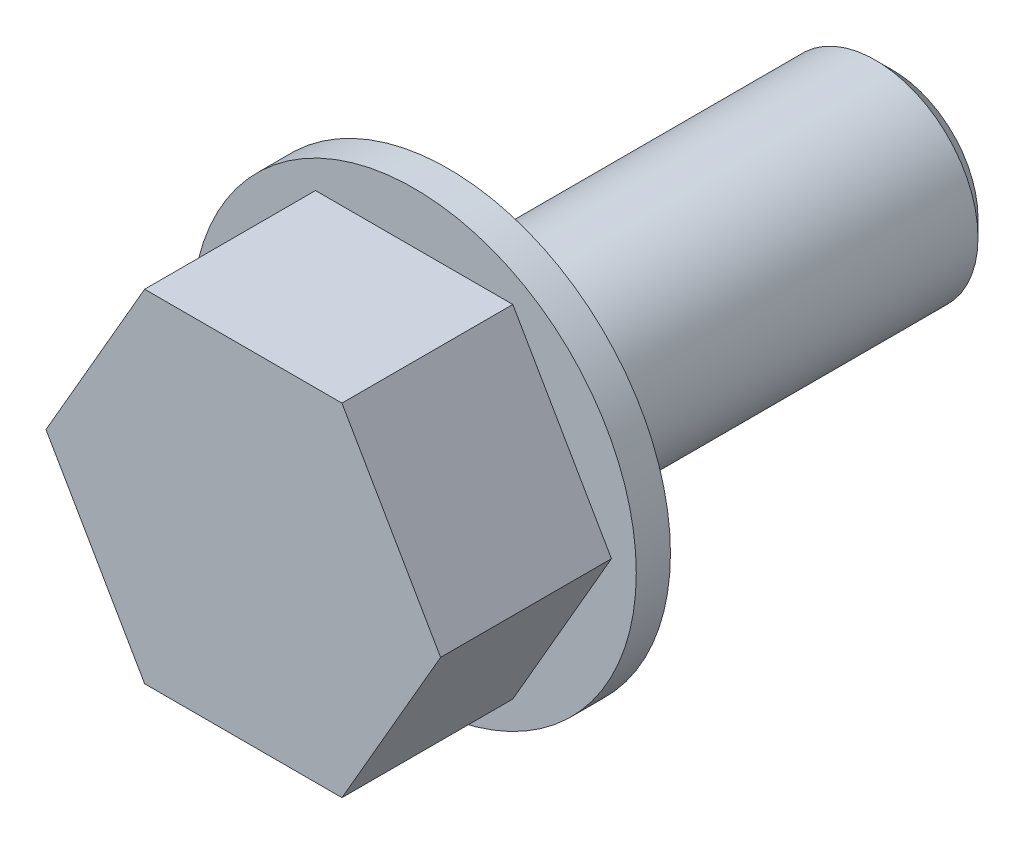
ISO-10303-21;
HEADER;
FILE_DESCRIPTION(('STEP AP214'),'2;1');
FILE_NAME('part.step','',(''),(''),'','','');
FILE_SCHEMA(('AUTOMOTIVE_DESIGN { 1 0 10303 214 1 1 1 1 }'));
ENDSEC;
DATA;
#1=APPLICATION_CONTEXT('core data for automotive mechanical design processes');
#2=APPLICATION_PROTOCOL_DEFINITION('international standard','automotive_design',2000,#1);
#3=PRODUCT_CONTEXT('',#1,'mechanical');
#4=PRODUCT('Part','Part','',(#3));
#5=PRODUCT_RELATED_PRODUCT_CATEGORY('part','',(#4));
#6=PRODUCT_DEFINITION_FORMATION('','',#4);
#7=PRODUCT_DEFINITION_CONTEXT('part definition',#1,'design');
#8=PRODUCT_DEFINITION('design','',#6,#7);
#9=PRODUCT_DEFINITION_SHAPE('','',#8);
#10=(LENGTH_UNIT() NAMED_UNIT(*) SI_UNIT(.MILLI.,.METRE.));
#11=(NAMED_UNIT(*) PLANE_ANGLE_UNIT() SI_UNIT($,.RADIAN.));
#12=(NAMED_UNIT(*) SI_UNIT($,.STERADIAN.) SOLID_ANGLE_UNIT());
#13=UNCERTAINTY_MEASURE_WITH_UNIT(LENGTH_MEASURE(1.E-05),#10,'distance_accuracy_value','');
#14=(GEOMETRIC_REPRESENTATION_CONTEXT(3) GLOBAL_UNCERTAINTY_ASSIGNED_CONTEXT((#13)) GLOBAL_UNIT_ASSIGNED_CONTEXT((#10,
#11,#12)) REPRESENTATION_CONTEXT('',''));
#15=CARTESIAN_POINT('',(0.,0.,0.));
#16=DIRECTION('',(0.,0.,1.));
#17=DIRECTION('',(1.,0.,0.));
#18=AXIS2_PLACEMENT_3D('',#15,#16,#17);
#19=CARTESIAN_POINT('',(73.2304529306439,0.00219609197998725,69.2922710574948));
#20=DIRECTION('',(0.,0.,-1.));
#21=DIRECTION('',(-1.,0.,0.));
#22=AXIS2_PLACEMENT_3D('',#19,#20,#21);
#23=PLANE('',#22);
#24=CARTESIAN_POINT('',(73.2304529306439,0.00219609197998725,69.2922710574948));
#25=DIRECTION('',(0.,0.,-1.));
#26=DIRECTION('',(1.,0.,0.));
#27=AXIS2_PLACEMENT_3D('',#24,#25,#26);
#28=CIRCLE('',#27,2.5);
#29=CARTESIAN_POINT('',(75.7304529306439,0.00219609197998725,69.2922710574948));
#30=VERTEX_POINT('',#29);
#31=EDGE_CURVE('E11',#30,#30,#28,.T.);
#32=ORIENTED_EDGE('',*,*,#31,.T.);
#33=EDGE_LOOP('',(#32));
#34=FACE_BOUND('',#33,.T.);
#35=ADVANCED_FACE('F17',(#34),#23,.T.);
#36=CARTESIAN_POINT('',(73.2304529306439,0.00219609197998725,82.2922710574948));
#37=DIRECTION('',(0.,0.,-1.));
#38=DIRECTION('',(-1.,0.,0.));
#39=AXIS2_PLACEMENT_3D('',#36,#37,#38);
#40=CYLINDRICAL_SURFACE('',#39,3.);
#41=CARTESIAN_POINT('',(73.2304529306439,0.00219609197998725,69.7922710574948));
#42=DIRECTION('',(0.,0.,-1.));
#43=DIRECTION('',(1.,0.,0.));
#44=AXIS2_PLACEMENT_3D('',#41,#42,#43);
#45=CIRCLE('',#44,3.);
#46=CARTESIAN_POINT('',(76.2304529306439,0.00219609197998725,69.7922710574948));
#47=VERTEX_POINT('',#46);
#48=EDGE_CURVE('E25',#47,#47,#45,.F.);
#49=ORIENTED_EDGE('',*,*,#48,.T.);
#50=EDGE_LOOP('',(#49));
#51=FACE_BOUND('',#50,.T.);
#52=CARTESIAN_POINT('',(73.2304529306439,0.00219609197998725,82.2922710574948));
#53=DIRECTION('',(0.,0.,-1.));
#54=DIRECTION('',(-1.,0.,0.));
#55=AXIS2_PLACEMENT_3D('',#52,#53,#54);
#56=CIRCLE('',#55,3.);
#57=CARTESIAN_POINT('',(70.2304529306439,0.00219609197998725,82.2922710574948));
#58=VERTEX_POINT('',#57);
#59=EDGE_CURVE('E95',#58,#58,#56,.T.);
#60=ORIENTED_EDGE('',*,*,#59,.T.);
#61=EDGE_LOOP('',(#60));
#62=FACE_BOUND('',#61,.T.);
#63=ADVANCED_FACE('F144',(#51,#62),#40,.T.);
#64=CARTESIAN_POINT('',(76.1172042765922,-4.99780390801963,82.2922710574948));
#65=DIRECTION('',(0.,0.,-1.));
#66=DIRECTION('',(-1.,0.,0.));
#67=AXIS2_PLACEMENT_3D('',#64,#65,#66);
#68=PLANE('',#67);
#69=ORIENTED_EDGE('',*,*,#59,.F.);
#70=EDGE_LOOP('',(#69));
#71=FACE_BOUND('',#70,.T.);
#72=CARTESIAN_POINT('',(73.2304529306439,0.00219609198037583,82.2922710574948));
#73=DIRECTION('',(0.,0.,1.));
#74=DIRECTION('',(-1.,0.,0.));
#75=AXIS2_PLACEMENT_3D('',#72,#73,#74);
#76=CIRCLE('',#75,6.5);
#77=CARTESIAN_POINT('',(66.7304529306439,0.00219609198037662,82.2922710574948));
#78=VERTEX_POINT('',#77);
#79=EDGE_CURVE('E130',#78,#78,#76,.T.);
#80=ORIENTED_EDGE('',*,*,#79,.F.);
#81=EDGE_LOOP('',(#80));
#82=FACE_BOUND('',#81,.T.);
#83=ADVANCED_FACE('F139',(#71,#82),#68,.T.);
#84=CARTESIAN_POINT('',(73.2304529306439,0.00219609198037583,83.2922710574948));
#85=DIRECTION('',(0.,0.,-1.));
#86=DIRECTION('',(-1.,0.,0.));
#87=AXIS2_PLACEMENT_3D('',#84,#85,#86);
#88=CYLINDRICAL_SURFACE('',#87,6.5);
#89=CARTESIAN_POINT('',(73.2304529306439,0.00219609198037583,83.2922710574948));
#90=DIRECTION('',(0.,0.,1.));
#91=DIRECTION('',(-1.,0.,0.));
#92=AXIS2_PLACEMENT_3D('',#89,#90,#91);
#93=CIRCLE('',#92,6.5);
#94=CARTESIAN_POINT('',(66.7304529306439,0.00219609198037662,83.2922710574948));
#95=VERTEX_POINT('',#94);
#96=EDGE_CURVE('E129',#95,#95,#93,.T.);
#97=ORIENTED_EDGE('',*,*,#96,.F.);
#98=EDGE_LOOP('',(#97));
#99=FACE_BOUND('',#98,.T.);
#100=ORIENTED_EDGE('',*,*,#79,.T.);
#101=EDGE_LOOP('',(#100));
#102=FACE_BOUND('',#101,.T.);
#103=ADVANCED_FACE('F136',(#99,#102),#88,.T.);
#104=CARTESIAN_POINT('',(73.2304529306439,0.00219609198037583,83.2922710574948));
#105=DIRECTION('',(0.,0.,1.));
#106=DIRECTION('',(1.,0.,0.));
#107=AXIS2_PLACEMENT_3D('',#104,#105,#106);
#108=PLANE('',#107);
#109=DIRECTION('',(0.5,-0.866025403784438,0.));
#110=VECTOR('',#109,1.);
#111=CARTESIAN_POINT('',(76.1172042765922,5.00219609198038,83.2922710574948));
#112=LINE('',#111,#110);
#113=CARTESIAN_POINT('',(76.1172042765922,5.00219609198038,83.2922710574948));
#114=VERTEX_POINT('',#113);
#115=CARTESIAN_POINT('',(79.0039556225403,0.00219609198037583,83.2922710574948));
#116=VERTEX_POINT('',#115);
#117=EDGE_CURVE('E74',#114,#116,#112,.T.);
#118=ORIENTED_EDGE('',*,*,#117,.T.);
#119=DIRECTION('',(-0.5,-0.86602540378444,0.));
#120=VECTOR('',#119,1.);
#121=CARTESIAN_POINT('',(79.0039556225403,0.00219609198037583,83.2922710574948));
#122=LINE('',#121,#120);
#123=CARTESIAN_POINT('',(76.1172042765922,-4.99780390801963,83.2922710574948));
#124=VERTEX_POINT('',#123);
#125=EDGE_CURVE('E84',#116,#124,#122,.T.);
#126=ORIENTED_EDGE('',*,*,#125,.T.);
#127=DIRECTION('',(-1.,0.,0.));
#128=VECTOR('',#127,1.);
#129=CARTESIAN_POINT('',(76.1172042765922,-4.99780390801963,83.2922710574948));
#130=LINE('',#129,#128);
#131=CARTESIAN_POINT('',(70.343701584696,-4.99780390801963,83.2922710574948));
#132=VERTEX_POINT('',#131);
#133=EDGE_CURVE('E32',#124,#132,#130,.T.);
#134=ORIENTED_EDGE('',*,*,#133,.T.);
#135=DIRECTION('',(-0.5,0.866025403784437,0.));
#136=VECTOR('',#135,1.);
#137=CARTESIAN_POINT('',(70.343701584696,-4.99780390801963,83.2922710574948));
#138=LINE('',#137,#136);
#139=CARTESIAN_POINT('',(67.4569502387478,0.00219609198037583,83.2922710574948));
#140=VERTEX_POINT('',#139);
#141=EDGE_CURVE('E40',#132,#140,#138,.T.);
#142=ORIENTED_EDGE('',*,*,#141,.T.);
#143=DIRECTION('',(0.5,0.866025403784439,0.));
#144=VECTOR('',#143,1.);
#145=CARTESIAN_POINT('',(67.4569502387478,0.00219609198037583,83.2922710574948));
#146=LINE('',#145,#144);
#147=CARTESIAN_POINT('',(70.343701584696,5.00219609198038,83.2922710574948));
#148=VERTEX_POINT('',#147);
#149=EDGE_CURVE('E126',#140,#148,#146,.T.);
#150=ORIENTED_EDGE('',*,*,#149,.T.);
#151=DIRECTION('',(1.,0.,0.));
#152=VECTOR('',#151,1.);
#153=CARTESIAN_POINT('',(70.343701584696,5.00219609198038,83.2922710574948));
#154=LINE('',#153,#152);
#155=EDGE_CURVE('E94',#148,#114,#154,.T.);
#156=ORIENTED_EDGE('',*,*,#155,.T.);
#157=EDGE_LOOP('',(#118,#126,#134,#142,#150,#156));
#158=FACE_BOUND('',#157,.T.);
#159=ORIENTED_EDGE('',*,*,#96,.T.);
#160=EDGE_LOOP('',(#159));
#161=FACE_BOUND('',#160,.T.);
#162=ADVANCED_FACE('F91',(#158,#161),#108,.T.);
#163=CARTESIAN_POINT('',(76.1172042765922,-4.99780390801963,88.2922710574948));
#164=DIRECTION('',(0.,0.,-1.));
#165=DIRECTION('',(-1.,0.,0.));
#166=AXIS2_PLACEMENT_3D('',#163,#164,#165);
#167=PLANE('',#166);
#168=DIRECTION('',(-0.5,-0.86602540378444,0.));
#169=VECTOR('',#168,1.);
#170=CARTESIAN_POINT('',(79.0039556225403,0.00219609198037583,88.2922710574948));
#171=LINE('',#170,#169);
#172=CARTESIAN_POINT('',(79.0039556225403,0.00219609198037583,88.2922710574948));
#173=VERTEX_POINT('',#172);
#174=CARTESIAN_POINT('',(76.1172042765922,-4.99780390801963,88.2922710574948));
#175=VERTEX_POINT('',#174);
#176=EDGE_CURVE('E88',#173,#175,#171,.T.);
#177=ORIENTED_EDGE('',*,*,#176,.F.);
#178=DIRECTION('',(0.5,-0.866025403784438,0.));
#179=VECTOR('',#178,1.);
#180=CARTESIAN_POINT('',(76.1172042765922,5.00219609198038,88.2922710574948));
#181=LINE('',#180,#179);
#182=CARTESIAN_POINT('',(76.1172042765922,5.00219609198038,88.2922710574948));
#183=VERTEX_POINT('',#182);
#184=EDGE_CURVE('E77',#183,#173,#181,.T.);
#185=ORIENTED_EDGE('',*,*,#184,.F.);
#186=DIRECTION('',(1.,0.,0.));
#187=VECTOR('',#186,1.);
#188=CARTESIAN_POINT('',(70.343701584696,5.00219609198038,88.2922710574948));
#189=LINE('',#188,#187);
#190=CARTESIAN_POINT('',(70.343701584696,5.00219609198038,88.2922710574948));
#191=VERTEX_POINT('',#190);
#192=EDGE_CURVE('E111',#191,#183,#189,.T.);
#193=ORIENTED_EDGE('',*,*,#192,.F.);
#194=DIRECTION('',(0.5,0.866025403784439,0.));
#195=VECTOR('',#194,1.);
#196=CARTESIAN_POINT('',(67.4569502387478,0.00219609198037583,88.2922710574948));
#197=LINE('',#196,#195);
#198=CARTESIAN_POINT('',(67.4569502387478,0.00219609198037583,88.2922710574948));
#199=VERTEX_POINT('',#198);
#200=EDGE_CURVE('E114',#199,#191,#197,.T.);
#201=ORIENTED_EDGE('',*,*,#200,.F.);
#202=DIRECTION('',(-0.5,0.866025403784437,0.));
#203=VECTOR('',#202,1.);
#204=CARTESIAN_POINT('',(70.343701584696,-4.99780390801963,88.2922710574948));
#205=LINE('',#204,#203);
#206=CARTESIAN_POINT('',(70.343701584696,-4.99780390801963,88.2922710574948));
#207=VERTEX_POINT('',#206);
#208=EDGE_CURVE('E117',#207,#199,#205,.T.);
#209=ORIENTED_EDGE('',*,*,#208,.F.);
#210=DIRECTION('',(-1.,0.,0.));
#211=VECTOR('',#210,1.);
#212=CARTESIAN_POINT('',(76.1172042765922,-4.99780390801963,88.2922710574948));
#213=LINE('',#212,#211);
#214=EDGE_CURVE('E120',#175,#207,#213,.T.);
#215=ORIENTED_EDGE('',*,*,#214,.F.);
#216=EDGE_LOOP('',(#177,#185,#193,#201,#209,#215));
#217=FACE_BOUND('',#216,.T.);
#218=ADVANCED_FACE('F177',(#217),#167,.F.);
#219=CARTESIAN_POINT('',(76.1172042765922,5.00219609198038,88.2922710574948));
#220=DIRECTION('',(0.866025403784438,0.5,0.));
#221=DIRECTION('',(0.5,-0.866025403784438,0.));
#222=AXIS2_PLACEMENT_3D('',#219,#220,#221);
#223=PLANE('',#222);
#224=ORIENTED_EDGE('',*,*,#117,.F.);
#225=DIRECTION('',(0.,0.,-1.));
#226=VECTOR('',#225,1.);
#227=CARTESIAN_POINT('',(76.1172042765922,5.00219609198038,88.2922710574948));
#228=LINE('',#227,#226);
#229=EDGE_CURVE('E81',#183,#114,#228,.T.);
#230=ORIENTED_EDGE('',*,*,#229,.F.);
#231=ORIENTED_EDGE('',*,*,#184,.T.);
#232=DIRECTION('',(0.,0.,-1.));
#233=VECTOR('',#232,1.);
#234=CARTESIAN_POINT('',(79.0039556225403,0.00219609198037583,88.2922710574948));
#235=LINE('',#234,#233);
#236=EDGE_CURVE('E70',#173,#116,#235,.T.);
#237=ORIENTED_EDGE('',*,*,#236,.T.);
#238=EDGE_LOOP('',(#224,#230,#231,#237));
#239=FACE_BOUND('',#238,.T.);
#240=ADVANCED_FACE('F72',(#239),#223,.T.);
#241=CARTESIAN_POINT('',(70.343701584696,5.00219609198038,88.2922710574948));
#242=DIRECTION('',(0.,1.,0.));
#243=DIRECTION('',(1.,0.,0.));
#244=AXIS2_PLACEMENT_3D('',#241,#242,#243);
#245=PLANE('',#244);
#246=ORIENTED_EDGE('',*,*,#155,.F.);
#247=DIRECTION('',(0.,0.,-1.));
#248=VECTOR('',#247,1.);
#249=CARTESIAN_POINT('',(70.343701584696,5.00219609198038,88.2922710574948));
#250=LINE('',#249,#248);
#251=EDGE_CURVE('E106',#191,#148,#250,.T.);
#252=ORIENTED_EDGE('',*,*,#251,.F.);
#253=ORIENTED_EDGE('',*,*,#192,.T.);
#254=ORIENTED_EDGE('',*,*,#229,.T.);
#255=EDGE_LOOP('',(#246,#252,#253,#254));
#256=FACE_BOUND('',#255,.T.);
#257=ADVANCED_FACE('F172',(#256),#245,.T.);
#258=CARTESIAN_POINT('',(67.4569502387478,0.00219609198037583,88.2922710574948));
#259=DIRECTION('',(-0.866025403784439,0.5,0.));
#260=DIRECTION('',(0.5,0.866025403784439,0.));
#261=AXIS2_PLACEMENT_3D('',#258,#259,#260);
#262=PLANE('',#261);
#263=ORIENTED_EDGE('',*,*,#149,.F.);
#264=DIRECTION('',(0.,0.,-1.));
#265=VECTOR('',#264,1.);
#266=CARTESIAN_POINT('',(67.4569502387478,0.00219609198037583,88.2922710574948));
#267=LINE('',#266,#265);
#268=EDGE_CURVE('E104',#199,#140,#267,.T.);
#269=ORIENTED_EDGE('',*,*,#268,.F.);
#270=ORIENTED_EDGE('',*,*,#200,.T.);
#271=ORIENTED_EDGE('',*,*,#251,.T.);
#272=EDGE_LOOP('',(#263,#269,#270,#271));
#273=FACE_BOUND('',#272,.T.);
#274=ADVANCED_FACE('F169',(#273),#262,.T.);
#275=CARTESIAN_POINT('',(70.343701584696,-4.99780390801963,88.2922710574948));
#276=DIRECTION('',(-0.866025403784437,-0.5,0.));
#277=DIRECTION('',(-0.5,0.866025403784437,0.));
#278=AXIS2_PLACEMENT_3D('',#275,#276,#277);
#279=PLANE('',#278);
#280=ORIENTED_EDGE('',*,*,#141,.F.);
#281=DIRECTION('',(0.,0.,-1.));
#282=VECTOR('',#281,1.);
#283=CARTESIAN_POINT('',(70.343701584696,-4.99780390801963,88.2922710574948));
#284=LINE('',#283,#282);
#285=EDGE_CURVE('E102',#207,#132,#284,.T.);
#286=ORIENTED_EDGE('',*,*,#285,.F.);
#287=ORIENTED_EDGE('',*,*,#208,.T.);
#288=ORIENTED_EDGE('',*,*,#268,.T.);
#289=EDGE_LOOP('',(#280,#286,#287,#288));
#290=FACE_BOUND('',#289,.T.);
#291=ADVANCED_FACE('F166',(#290),#279,.T.);
#292=CARTESIAN_POINT('',(76.1172042765922,-4.99780390801963,88.2922710574948));
#293=DIRECTION('',(0.,-1.,0.));
#294=DIRECTION('',(-1.,0.,0.));
#295=AXIS2_PLACEMENT_3D('',#292,#293,#294);
#296=PLANE('',#295);
#297=ORIENTED_EDGE('',*,*,#133,.F.);
#298=DIRECTION('',(0.,0.,-1.));
#299=VECTOR('',#298,1.);
#300=CARTESIAN_POINT('',(76.1172042765922,-4.99780390801963,88.2922710574948));
#301=LINE('',#300,#299);
#302=EDGE_CURVE('E86',#175,#124,#301,.T.);
#303=ORIENTED_EDGE('',*,*,#302,.F.);
#304=ORIENTED_EDGE('',*,*,#214,.T.);
#305=ORIENTED_EDGE('',*,*,#285,.T.);
#306=EDGE_LOOP('',(#297,#303,#304,#305));
#307=FACE_BOUND('',#306,.T.);
#308=ADVANCED_FACE('F163',(#307),#296,.T.);
#309=CARTESIAN_POINT('',(79.0039556225403,0.00219609198037583,88.2922710574948));
#310=DIRECTION('',(0.86602540378444,-0.5,0.));
#311=DIRECTION('',(-0.5,-0.86602540378444,0.));
#312=AXIS2_PLACEMENT_3D('',#309,#310,#311);
#313=PLANE('',#312);
#314=ORIENTED_EDGE('',*,*,#125,.F.);
#315=ORIENTED_EDGE('',*,*,#236,.F.);
#316=ORIENTED_EDGE('',*,*,#176,.T.);
#317=ORIENTED_EDGE('',*,*,#302,.T.);
#318=EDGE_LOOP('',(#314,#315,#316,#317));
#319=FACE_BOUND('',#318,.T.);
#320=ADVANCED_FACE('F85',(#319),#313,.T.);
#321=CARTESIAN_POINT('',(73.2304529306439,0.00219609197998725,69.7922710574948));
#322=DIRECTION('',(0.,0.,1.));
#323=DIRECTION('',(-1.,0.,0.));
#324=AXIS2_PLACEMENT_3D('',#321,#322,#323);
#325=CONICAL_SURFACE('',#324,3.,0.785398163397448);
#326=ORIENTED_EDGE('',*,*,#31,.F.);
#327=EDGE_LOOP('',(#326));
#328=FACE_BOUND('',#327,.T.);
#329=ORIENTED_EDGE('',*,*,#48,.F.);
#330=EDGE_LOOP('',(#329));
#331=FACE_BOUND('',#330,.T.);
#332=ADVANCED_FACE('F19',(#328,#331),#325,.T.);
#333=CLOSED_SHELL('',(#35,#63,#83,#103,#162,#218,#240,#257,#274,#291,#308,#320,#332));
#334=MANIFOLD_SOLID_BREP('B1',#333);
#335=ADVANCED_BREP_SHAPE_REPRESENTATION('',(#18,#334),#14);
#336=SHAPE_DEFINITION_REPRESENTATION(#9,#335);
ENDSEC;
END-ISO-10303-21;
